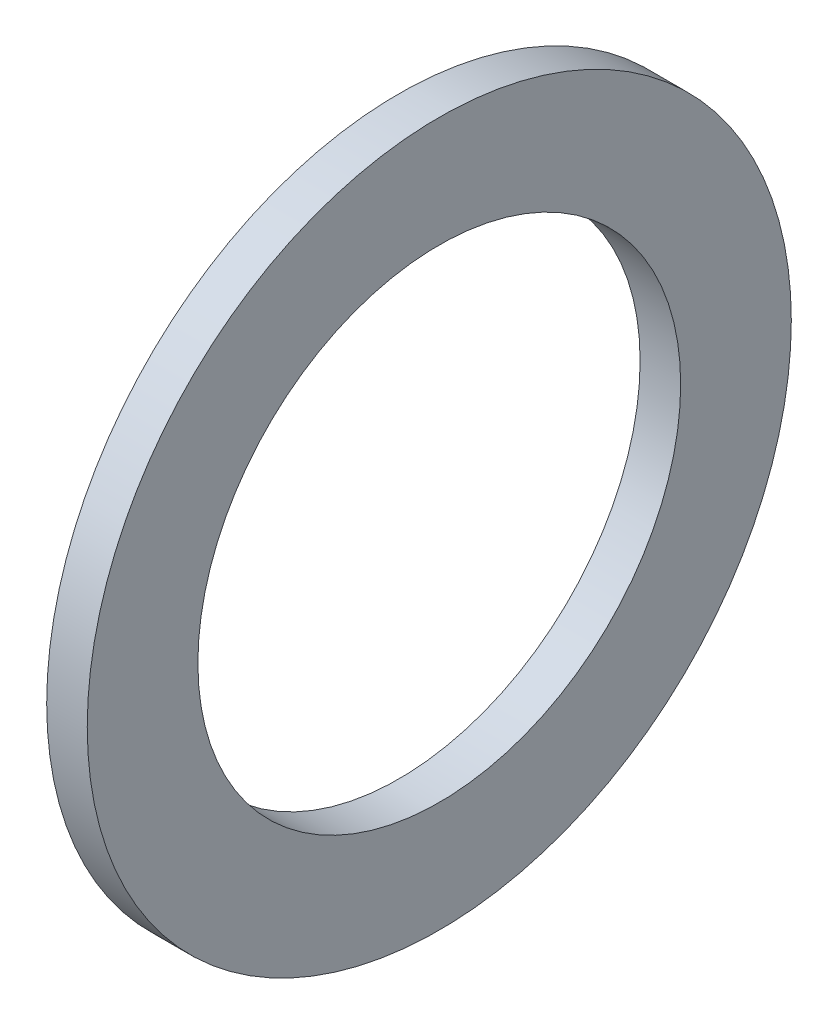
ISO-10303-21;
HEADER;
FILE_DESCRIPTION(('STEP AP214'),'2;1');
FILE_NAME('part.step','',(''),(''),'','','');
FILE_SCHEMA(('AUTOMOTIVE_DESIGN { 1 0 10303 214 1 1 1 1 }'));
ENDSEC;
DATA;
#1=APPLICATION_CONTEXT('core data for automotive mechanical design processes');
#2=APPLICATION_PROTOCOL_DEFINITION('international standard','automotive_design',2000,#1);
#3=PRODUCT_CONTEXT('',#1,'mechanical');
#4=PRODUCT('Part','Part','',(#3));
#5=PRODUCT_RELATED_PRODUCT_CATEGORY('part','',(#4));
#6=PRODUCT_DEFINITION_FORMATION('','',#4);
#7=PRODUCT_DEFINITION_CONTEXT('part definition',#1,'design');
#8=PRODUCT_DEFINITION('design','',#6,#7);
#9=PRODUCT_DEFINITION_SHAPE('','',#8);
#10=(LENGTH_UNIT() NAMED_UNIT(*) SI_UNIT(.MILLI.,.METRE.));
#11=(NAMED_UNIT(*) PLANE_ANGLE_UNIT() SI_UNIT($,.RADIAN.));
#12=(NAMED_UNIT(*) SI_UNIT($,.STERADIAN.) SOLID_ANGLE_UNIT());
#13=UNCERTAINTY_MEASURE_WITH_UNIT(LENGTH_MEASURE(1.E-05),#10,'distance_accuracy_value','');
#14=(GEOMETRIC_REPRESENTATION_CONTEXT(3) GLOBAL_UNCERTAINTY_ASSIGNED_CONTEXT((#13)) GLOBAL_UNIT_ASSIGNED_CONTEXT((#10,
#11,#12)) REPRESENTATION_CONTEXT('',''));
#15=CARTESIAN_POINT('',(0.,0.,0.));
#16=DIRECTION('',(0.,0.,1.));
#17=DIRECTION('',(1.,0.,0.));
#18=AXIS2_PLACEMENT_3D('',#15,#16,#17);
#19=CARTESIAN_POINT('',(0.,0.,0.));
#20=DIRECTION('',(1.,0.,0.));
#21=DIRECTION('',(0.,0.,-1.));
#22=AXIS2_PLACEMENT_3D('',#19,#20,#21);
#23=PLANE('',#22);
#24=CARTESIAN_POINT('',(0.,0.,0.));
#25=DIRECTION('',(-1.,0.,0.));
#26=DIRECTION('',(0.,0.,1.));
#27=AXIS2_PLACEMENT_3D('',#24,#25,#26);
#28=CIRCLE('',#27,19.05);
#29=CARTESIAN_POINT('',(0.,0.,19.05));
#30=VERTEX_POINT('',#29);
#31=EDGE_CURVE('E26',#30,#30,#28,.F.);
#32=ORIENTED_EDGE('',*,*,#31,.T.);
#33=EDGE_LOOP('',(#32));
#34=FACE_BOUND('',#33,.T.);
#35=CARTESIAN_POINT('',(0.,0.,0.));
#36=DIRECTION('',(-1.,0.,0.));
#37=DIRECTION('',(0.,0.,1.));
#38=AXIS2_PLACEMENT_3D('',#35,#36,#37);
#39=CIRCLE('',#38,27.78125);
#40=CARTESIAN_POINT('',(0.,0.,27.78125));
#41=VERTEX_POINT('',#40);
#42=EDGE_CURVE('E17',#41,#41,#39,.F.);
#43=ORIENTED_EDGE('',*,*,#42,.F.);
#44=EDGE_LOOP('',(#43));
#45=FACE_BOUND('',#44,.T.);
#46=ADVANCED_FACE('F14',(#34,#45),#23,.F.);
#47=CARTESIAN_POINT('',(3.2004,0.,0.));
#48=DIRECTION('',(-1.,0.,0.));
#49=DIRECTION('',(0.,0.,1.));
#50=AXIS2_PLACEMENT_3D('',#47,#48,#49);
#51=CYLINDRICAL_SURFACE('',#50,27.78125);
#52=ORIENTED_EDGE('',*,*,#42,.T.);
#53=EDGE_LOOP('',(#52));
#54=FACE_BOUND('',#53,.T.);
#55=CARTESIAN_POINT('',(3.2004,0.,0.));
#56=DIRECTION('',(-1.,0.,0.));
#57=DIRECTION('',(0.,0.,1.));
#58=AXIS2_PLACEMENT_3D('',#55,#56,#57);
#59=CIRCLE('',#58,27.78125);
#60=CARTESIAN_POINT('',(3.2004,0.,27.78125));
#61=VERTEX_POINT('',#60);
#62=EDGE_CURVE('E21',#61,#61,#59,.F.);
#63=ORIENTED_EDGE('',*,*,#62,.F.);
#64=EDGE_LOOP('',(#63));
#65=FACE_BOUND('',#64,.T.);
#66=ADVANCED_FACE('F34',(#54,#65),#51,.T.);
#67=CARTESIAN_POINT('',(3.2004,0.,0.));
#68=DIRECTION('',(-1.,0.,0.));
#69=DIRECTION('',(0.,0.,1.));
#70=AXIS2_PLACEMENT_3D('',#67,#68,#69);
#71=CYLINDRICAL_SURFACE('',#70,19.05);
#72=ORIENTED_EDGE('',*,*,#31,.F.);
#73=EDGE_LOOP('',(#72));
#74=FACE_BOUND('',#73,.T.);
#75=CARTESIAN_POINT('',(3.2004,0.,0.));
#76=DIRECTION('',(-1.,0.,0.));
#77=DIRECTION('',(0.,0.,1.));
#78=AXIS2_PLACEMENT_3D('',#75,#76,#77);
#79=CIRCLE('',#78,19.05);
#80=CARTESIAN_POINT('',(3.2004,0.,19.05));
#81=VERTEX_POINT('',#80);
#82=EDGE_CURVE('E10',#81,#81,#79,.T.);
#83=ORIENTED_EDGE('',*,*,#82,.F.);
#84=EDGE_LOOP('',(#83));
#85=FACE_BOUND('',#84,.T.);
#86=ADVANCED_FACE('F42',(#74,#85),#71,.F.);
#87=CARTESIAN_POINT('',(3.2004,0.,0.));
#88=DIRECTION('',(1.,0.,0.));
#89=DIRECTION('',(0.,0.,-1.));
#90=AXIS2_PLACEMENT_3D('',#87,#88,#89);
#91=PLANE('',#90);
#92=ORIENTED_EDGE('',*,*,#82,.T.);
#93=EDGE_LOOP('',(#92));
#94=FACE_BOUND('',#93,.T.);
#95=ORIENTED_EDGE('',*,*,#62,.T.);
#96=EDGE_LOOP('',(#95));
#97=FACE_BOUND('',#96,.T.);
#98=ADVANCED_FACE('F43',(#94,#97),#91,.T.);
#99=CLOSED_SHELL('',(#46,#66,#86,#98));
#100=MANIFOLD_SOLID_BREP('B1',#99);
#101=ADVANCED_BREP_SHAPE_REPRESENTATION('',(#18,#100),#14);
#102=SHAPE_DEFINITION_REPRESENTATION(#9,#101);
ENDSEC;
END-ISO-10303-21;
